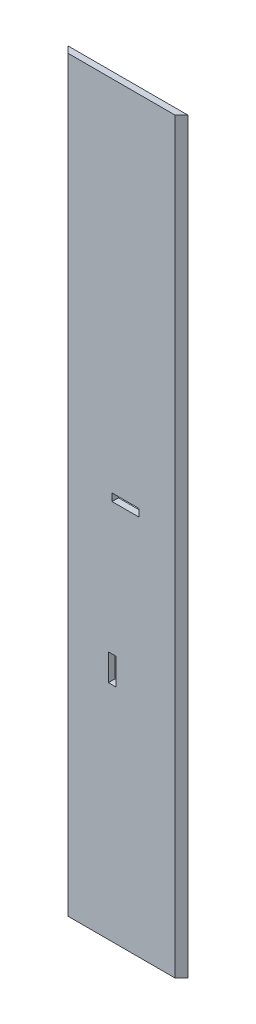
ISO-10303-21;
HEADER;
FILE_DESCRIPTION(('STEP AP214'),'2;1');
FILE_NAME('part.step','',(''),(''),'','','');
FILE_SCHEMA(('AUTOMOTIVE_DESIGN { 1 0 10303 214 1 1 1 1 }'));
ENDSEC;
DATA;
#1=APPLICATION_CONTEXT('core data for automotive mechanical design processes');
#2=APPLICATION_PROTOCOL_DEFINITION('international standard','automotive_design',2000,#1);
#3=PRODUCT_CONTEXT('',#1,'mechanical');
#4=PRODUCT('Part','Part','',(#3));
#5=PRODUCT_RELATED_PRODUCT_CATEGORY('part','',(#4));
#6=PRODUCT_DEFINITION_FORMATION('','',#4);
#7=PRODUCT_DEFINITION_CONTEXT('part definition',#1,'design');
#8=PRODUCT_DEFINITION('design','',#6,#7);
#9=PRODUCT_DEFINITION_SHAPE('','',#8);
#10=(LENGTH_UNIT() NAMED_UNIT(*) SI_UNIT(.MILLI.,.METRE.));
#11=(NAMED_UNIT(*) PLANE_ANGLE_UNIT() SI_UNIT($,.RADIAN.));
#12=(NAMED_UNIT(*) SI_UNIT($,.STERADIAN.) SOLID_ANGLE_UNIT());
#13=UNCERTAINTY_MEASURE_WITH_UNIT(LENGTH_MEASURE(1.E-05),#10,'distance_accuracy_value','');
#14=(GEOMETRIC_REPRESENTATION_CONTEXT(3) GLOBAL_UNCERTAINTY_ASSIGNED_CONTEXT((#13)) GLOBAL_UNIT_ASSIGNED_CONTEXT((#10,
#11,#12)) REPRESENTATION_CONTEXT('',''));
#15=CARTESIAN_POINT('',(0.,0.,0.));
#16=DIRECTION('',(0.,0.,1.));
#17=DIRECTION('',(1.,0.,0.));
#18=AXIS2_PLACEMENT_3D('',#15,#16,#17);
#19=CARTESIAN_POINT('',(25.,175.,3.00000000000006));
#20=DIRECTION('',(0.707106781186552,0.,0.707106781186543));
#21=DIRECTION('',(0.707106781186543,0.,-0.707106781186552));
#22=AXIS2_PLACEMENT_3D('',#19,#20,#21);
#23=PLANE('',#22);
#24=DIRECTION('',(-0.707106781186543,0.,0.707106781186552));
#25=VECTOR('',#24,1.);
#26=CARTESIAN_POINT('',(25.,-175.,3.00000000000006));
#27=LINE('',#26,#25);
#28=CARTESIAN_POINT('',(28.,-175.,0.));
#29=VERTEX_POINT('',#28);
#30=CARTESIAN_POINT('',(25.,-175.,3.));
#31=VERTEX_POINT('',#30);
#32=EDGE_CURVE('E234',#29,#31,#27,.T.);
#33=ORIENTED_EDGE('',*,*,#32,.F.);
#34=DIRECTION('',(0.,-1.,0.));
#35=VECTOR('',#34,1.);
#36=CARTESIAN_POINT('',(28.,175.,0.));
#37=LINE('',#36,#35);
#38=CARTESIAN_POINT('',(28.,175.,0.));
#39=VERTEX_POINT('',#38);
#40=EDGE_CURVE('E215',#39,#29,#37,.T.);
#41=ORIENTED_EDGE('',*,*,#40,.F.);
#42=DIRECTION('',(-0.707106781186543,0.,0.707106781186552));
#43=VECTOR('',#42,1.);
#44=CARTESIAN_POINT('',(25.,175.,3.00000000000006));
#45=LINE('',#44,#43);
#46=CARTESIAN_POINT('',(25.,175.,3.));
#47=VERTEX_POINT('',#46);
#48=EDGE_CURVE('E242',#39,#47,#45,.T.);
#49=ORIENTED_EDGE('',*,*,#48,.T.);
#50=DIRECTION('',(0.,1.,0.));
#51=VECTOR('',#50,1.);
#52=CARTESIAN_POINT('',(25.,-175.,3.));
#53=LINE('',#52,#51);
#54=EDGE_CURVE('E12',#31,#47,#53,.T.);
#55=ORIENTED_EDGE('',*,*,#54,.F.);
#56=EDGE_LOOP('',(#33,#41,#49,#55));
#57=FACE_BOUND('',#56,.T.);
#58=ADVANCED_FACE('F46',(#57),#23,.T.);
#59=CARTESIAN_POINT('',(25.,175.,3.));
#60=DIRECTION('',(0.,-1.,0.));
#61=DIRECTION('',(0.,0.,-1.));
#62=AXIS2_PLACEMENT_3D('',#59,#60,#61);
#63=PLANE('',#62);
#64=DIRECTION('',(-1.,0.,0.));
#65=VECTOR('',#64,1.);
#66=CARTESIAN_POINT('',(25.,175.,0.));
#67=LINE('',#66,#65);
#68=CARTESIAN_POINT('',(-28.,175.,0.));
#69=VERTEX_POINT('',#68);
#70=EDGE_CURVE('E238',#39,#69,#67,.T.);
#71=ORIENTED_EDGE('',*,*,#70,.T.);
#72=DIRECTION('',(-0.707106781186541,0.,-0.707106781186554));
#73=VECTOR('',#72,1.);
#74=CARTESIAN_POINT('',(-25.,175.,3.));
#75=LINE('',#74,#73);
#76=CARTESIAN_POINT('',(-25.,175.,3.));
#77=VERTEX_POINT('',#76);
#78=EDGE_CURVE('E225',#77,#69,#75,.T.);
#79=ORIENTED_EDGE('',*,*,#78,.F.);
#80=DIRECTION('',(-1.,0.,0.));
#81=VECTOR('',#80,1.);
#82=CARTESIAN_POINT('',(25.,175.,3.));
#83=LINE('',#82,#81);
#84=EDGE_CURVE('E249',#47,#77,#83,.T.);
#85=ORIENTED_EDGE('',*,*,#84,.F.);
#86=ORIENTED_EDGE('',*,*,#48,.F.);
#87=EDGE_LOOP('',(#71,#79,#85,#86));
#88=FACE_BOUND('',#87,.T.);
#89=ADVANCED_FACE('F48',(#88),#63,.F.);
#90=CARTESIAN_POINT('',(25.,-175.,3.));
#91=DIRECTION('',(0.,1.,0.));
#92=DIRECTION('',(0.,0.,1.));
#93=AXIS2_PLACEMENT_3D('',#90,#91,#92);
#94=PLANE('',#93);
#95=DIRECTION('',(1.,0.,0.));
#96=VECTOR('',#95,1.);
#97=CARTESIAN_POINT('',(25.,-175.,0.));
#98=LINE('',#97,#96);
#99=CARTESIAN_POINT('',(-28.,-175.,0.));
#100=VERTEX_POINT('',#99);
#101=EDGE_CURVE('E50',#100,#29,#98,.T.);
#102=ORIENTED_EDGE('',*,*,#101,.T.);
#103=ORIENTED_EDGE('',*,*,#32,.T.);
#104=DIRECTION('',(1.,0.,0.));
#105=VECTOR('',#104,1.);
#106=CARTESIAN_POINT('',(25.,-175.,3.));
#107=LINE('',#106,#105);
#108=CARTESIAN_POINT('',(-25.,-175.,3.));
#109=VERTEX_POINT('',#108);
#110=EDGE_CURVE('E56',#109,#31,#107,.T.);
#111=ORIENTED_EDGE('',*,*,#110,.F.);
#112=DIRECTION('',(-0.707106781186541,0.,-0.707106781186554));
#113=VECTOR('',#112,1.);
#114=CARTESIAN_POINT('',(-25.,-175.,3.));
#115=LINE('',#114,#113);
#116=EDGE_CURVE('E230',#109,#100,#115,.T.);
#117=ORIENTED_EDGE('',*,*,#116,.T.);
#118=EDGE_LOOP('',(#102,#103,#111,#117));
#119=FACE_BOUND('',#118,.T.);
#120=ADVANCED_FACE('F263',(#119),#94,.F.);
#121=CARTESIAN_POINT('',(0.,0.,3.));
#122=DIRECTION('',(0.,0.,-1.));
#123=DIRECTION('',(-1.,0.,0.));
#124=AXIS2_PLACEMENT_3D('',#121,#122,#123);
#125=PLANE('',#124);
#126=DIRECTION('',(0.,-1.,0.));
#127=VECTOR('',#126,1.);
#128=CARTESIAN_POINT('',(8.03805566879869,3.50000000000824,3.));
#129=LINE('',#128,#127);
#130=CARTESIAN_POINT('',(8.03805566879869,7.00000000000824,3.));
#131=VERTEX_POINT('',#130);
#132=CARTESIAN_POINT('',(8.03805566879869,3.50000000000824,3.));
#133=VERTEX_POINT('',#132);
#134=EDGE_CURVE('E174',#131,#133,#129,.T.);
#135=ORIENTED_EDGE('',*,*,#134,.T.);
#136=DIRECTION('',(-1.,0.,0.));
#137=VECTOR('',#136,1.);
#138=CARTESIAN_POINT('',(-4.46194433120131,3.50000000000824,3.));
#139=LINE('',#138,#137);
#140=CARTESIAN_POINT('',(-4.46194433120131,3.50000000000824,3.));
#141=VERTEX_POINT('',#140);
#142=EDGE_CURVE('E143',#133,#141,#139,.T.);
#143=ORIENTED_EDGE('',*,*,#142,.T.);
#144=DIRECTION('',(0.,1.,0.));
#145=VECTOR('',#144,1.);
#146=CARTESIAN_POINT('',(-4.46194433120131,3.50000000000824,3.));
#147=LINE('',#146,#145);
#148=CARTESIAN_POINT('',(-4.46194433120131,7.00000000000824,3.));
#149=VERTEX_POINT('',#148);
#150=EDGE_CURVE('E180',#141,#149,#147,.T.);
#151=ORIENTED_EDGE('',*,*,#150,.T.);
#152=DIRECTION('',(1.,0.,0.));
#153=VECTOR('',#152,1.);
#154=CARTESIAN_POINT('',(-4.46194433120131,7.00000000000824,3.));
#155=LINE('',#154,#153);
#156=EDGE_CURVE('E64',#149,#131,#155,.T.);
#157=ORIENTED_EDGE('',*,*,#156,.T.);
#158=EDGE_LOOP('',(#135,#143,#151,#157));
#159=FACE_BOUND('',#158,.T.);
#160=DIRECTION('',(-1.,0.,0.));
#161=VECTOR('',#160,1.);
#162=CARTESIAN_POINT('',(-6.19075959069311,-70.8073765712001,3.));
#163=LINE('',#162,#161);
#164=CARTESIAN_POINT('',(-2.69075959069311,-70.8073765712001,3.));
#165=VERTEX_POINT('',#164);
#166=CARTESIAN_POINT('',(-6.19075959069311,-70.8073765712001,3.));
#167=VERTEX_POINT('',#166);
#168=EDGE_CURVE('E197',#165,#167,#163,.T.);
#169=ORIENTED_EDGE('',*,*,#168,.T.);
#170=DIRECTION('',(0.,1.,0.));
#171=VECTOR('',#170,1.);
#172=CARTESIAN_POINT('',(-6.19075959069311,-70.8073765712001,3.));
#173=LINE('',#172,#171);
#174=CARTESIAN_POINT('',(-6.19075959069311,-58.3073765712001,3.));
#175=VERTEX_POINT('',#174);
#176=EDGE_CURVE('E186',#167,#175,#173,.T.);
#177=ORIENTED_EDGE('',*,*,#176,.T.);
#178=DIRECTION('',(1.,0.,0.));
#179=VECTOR('',#178,1.);
#180=CARTESIAN_POINT('',(-6.19075959069311,-58.3073765712001,3.));
#181=LINE('',#180,#179);
#182=CARTESIAN_POINT('',(-2.69075959069311,-58.3073765712001,3.));
#183=VERTEX_POINT('',#182);
#184=EDGE_CURVE('E190',#175,#183,#181,.T.);
#185=ORIENTED_EDGE('',*,*,#184,.T.);
#186=DIRECTION('',(0.,-1.,0.));
#187=VECTOR('',#186,1.);
#188=CARTESIAN_POINT('',(-2.69075959069311,-70.8073765712001,3.));
#189=LINE('',#188,#187);
#190=EDGE_CURVE('E72',#183,#165,#189,.T.);
#191=ORIENTED_EDGE('',*,*,#190,.T.);
#192=EDGE_LOOP('',(#169,#177,#185,#191));
#193=FACE_BOUND('',#192,.T.);
#194=ORIENTED_EDGE('',*,*,#84,.T.);
#195=DIRECTION('',(0.,-1.,0.));
#196=VECTOR('',#195,1.);
#197=CARTESIAN_POINT('',(-25.,-175.,3.));
#198=LINE('',#197,#196);
#199=EDGE_CURVE('E252',#77,#109,#198,.T.);
#200=ORIENTED_EDGE('',*,*,#199,.T.);
#201=ORIENTED_EDGE('',*,*,#110,.T.);
#202=ORIENTED_EDGE('',*,*,#54,.T.);
#203=EDGE_LOOP('',(#194,#200,#201,#202));
#204=FACE_BOUND('',#203,.T.);
#205=ADVANCED_FACE('F273',(#159,#193,#204),#125,.F.);
#206=CARTESIAN_POINT('',(0.,0.,0.));
#207=DIRECTION('',(0.,0.,-1.));
#208=DIRECTION('',(-1.,0.,0.));
#209=AXIS2_PLACEMENT_3D('',#206,#207,#208);
#210=PLANE('',#209);
#211=DIRECTION('',(-1.,0.,0.));
#212=VECTOR('',#211,1.);
#213=CARTESIAN_POINT('',(-4.46194433120131,3.50000000000824,0.));
#214=LINE('',#213,#212);
#215=CARTESIAN_POINT('',(8.03805566879869,3.50000000000824,0.));
#216=VERTEX_POINT('',#215);
#217=CARTESIAN_POINT('',(-4.46194433120131,3.50000000000824,0.));
#218=VERTEX_POINT('',#217);
#219=EDGE_CURVE('E140',#216,#218,#214,.T.);
#220=ORIENTED_EDGE('',*,*,#219,.F.);
#221=DIRECTION('',(0.,-1.,0.));
#222=VECTOR('',#221,1.);
#223=CARTESIAN_POINT('',(8.03805566879869,3.50000000000824,0.));
#224=LINE('',#223,#222);
#225=CARTESIAN_POINT('',(8.03805566879869,7.00000000000824,0.));
#226=VERTEX_POINT('',#225);
#227=EDGE_CURVE('E151',#226,#216,#224,.T.);
#228=ORIENTED_EDGE('',*,*,#227,.F.);
#229=DIRECTION('',(1.,0.,0.));
#230=VECTOR('',#229,1.);
#231=CARTESIAN_POINT('',(-4.46194433120131,7.00000000000824,0.));
#232=LINE('',#231,#230);
#233=CARTESIAN_POINT('',(-4.46194433120131,7.00000000000824,0.));
#234=VERTEX_POINT('',#233);
#235=EDGE_CURVE('E157',#234,#226,#232,.T.);
#236=ORIENTED_EDGE('',*,*,#235,.F.);
#237=DIRECTION('',(0.,1.,0.));
#238=VECTOR('',#237,1.);
#239=CARTESIAN_POINT('',(-4.46194433120131,3.50000000000824,0.));
#240=LINE('',#239,#238);
#241=EDGE_CURVE('E163',#218,#234,#240,.T.);
#242=ORIENTED_EDGE('',*,*,#241,.F.);
#243=EDGE_LOOP('',(#220,#228,#236,#242));
#244=FACE_BOUND('',#243,.T.);
#245=DIRECTION('',(0.,1.,0.));
#246=VECTOR('',#245,1.);
#247=CARTESIAN_POINT('',(-6.19075959069311,-70.8073765712001,0.));
#248=LINE('',#247,#246);
#249=CARTESIAN_POINT('',(-6.19075959069311,-70.8073765712001,0.));
#250=VERTEX_POINT('',#249);
#251=CARTESIAN_POINT('',(-6.19075959069311,-58.3073765712001,0.));
#252=VERTEX_POINT('',#251);
#253=EDGE_CURVE('E165',#250,#252,#248,.T.);
#254=ORIENTED_EDGE('',*,*,#253,.F.);
#255=DIRECTION('',(-1.,0.,0.));
#256=VECTOR('',#255,1.);
#257=CARTESIAN_POINT('',(-6.19075959069311,-70.8073765712001,0.));
#258=LINE('',#257,#256);
#259=CARTESIAN_POINT('',(-2.69075959069311,-70.8073765712001,0.));
#260=VERTEX_POINT('',#259);
#261=EDGE_CURVE('E191',#260,#250,#258,.T.);
#262=ORIENTED_EDGE('',*,*,#261,.F.);
#263=DIRECTION('',(0.,-1.,0.));
#264=VECTOR('',#263,1.);
#265=CARTESIAN_POINT('',(-2.69075959069311,-70.8073765712001,0.));
#266=LINE('',#265,#264);
#267=CARTESIAN_POINT('',(-2.69075959069311,-58.3073765712001,0.));
#268=VERTEX_POINT('',#267);
#269=EDGE_CURVE('E205',#268,#260,#266,.T.);
#270=ORIENTED_EDGE('',*,*,#269,.F.);
#271=DIRECTION('',(1.,0.,0.));
#272=VECTOR('',#271,1.);
#273=CARTESIAN_POINT('',(-6.19075959069311,-58.3073765712001,0.));
#274=LINE('',#273,#272);
#275=EDGE_CURVE('E169',#252,#268,#274,.T.);
#276=ORIENTED_EDGE('',*,*,#275,.F.);
#277=EDGE_LOOP('',(#254,#262,#270,#276));
#278=FACE_BOUND('',#277,.T.);
#279=ORIENTED_EDGE('',*,*,#70,.F.);
#280=ORIENTED_EDGE('',*,*,#40,.T.);
#281=ORIENTED_EDGE('',*,*,#101,.F.);
#282=DIRECTION('',(0.,-1.,0.));
#283=VECTOR('',#282,1.);
#284=CARTESIAN_POINT('',(-28.,175.,0.));
#285=LINE('',#284,#283);
#286=EDGE_CURVE('E229',#69,#100,#285,.T.);
#287=ORIENTED_EDGE('',*,*,#286,.F.);
#288=EDGE_LOOP('',(#279,#280,#281,#287));
#289=FACE_BOUND('',#288,.T.);
#290=ADVANCED_FACE('F160',(#244,#278,#289),#210,.T.);
#291=CARTESIAN_POINT('',(-25.,175.,3.));
#292=DIRECTION('',(-0.707106781186554,0.,0.707106781186541));
#293=DIRECTION('',(0.707106781186541,0.,0.707106781186554));
#294=AXIS2_PLACEMENT_3D('',#291,#292,#293);
#295=PLANE('',#294);
#296=ORIENTED_EDGE('',*,*,#116,.F.);
#297=ORIENTED_EDGE('',*,*,#199,.F.);
#298=ORIENTED_EDGE('',*,*,#78,.T.);
#299=ORIENTED_EDGE('',*,*,#286,.T.);
#300=EDGE_LOOP('',(#296,#297,#298,#299));
#301=FACE_BOUND('',#300,.T.);
#302=ADVANCED_FACE('F276',(#301),#295,.T.);
#303=CARTESIAN_POINT('',(-6.19075959069311,-70.8073765712001,3.));
#304=DIRECTION('',(-1.,0.,0.));
#305=DIRECTION('',(0.,0.,1.));
#306=AXIS2_PLACEMENT_3D('',#303,#304,#305);
#307=PLANE('',#306);
#308=ORIENTED_EDGE('',*,*,#253,.T.);
#309=DIRECTION('',(0.,0.,-1.));
#310=VECTOR('',#309,1.);
#311=CARTESIAN_POINT('',(-6.19075959069311,-58.3073765712001,3.));
#312=LINE('',#311,#310);
#313=EDGE_CURVE('E200',#175,#252,#312,.T.);
#314=ORIENTED_EDGE('',*,*,#313,.F.);
#315=ORIENTED_EDGE('',*,*,#176,.F.);
#316=DIRECTION('',(0.,0.,-1.));
#317=VECTOR('',#316,1.);
#318=CARTESIAN_POINT('',(-6.19075959069311,-70.8073765712001,3.));
#319=LINE('',#318,#317);
#320=EDGE_CURVE('E212',#167,#250,#319,.T.);
#321=ORIENTED_EDGE('',*,*,#320,.T.);
#322=EDGE_LOOP('',(#308,#314,#315,#321));
#323=FACE_BOUND('',#322,.T.);
#324=ADVANCED_FACE('F278',(#323),#307,.F.);
#325=CARTESIAN_POINT('',(-6.19075959069311,-70.8073765712001,3.));
#326=DIRECTION('',(0.,-1.,0.));
#327=DIRECTION('',(0.,0.,-1.));
#328=AXIS2_PLACEMENT_3D('',#325,#326,#327);
#329=PLANE('',#328);
#330=ORIENTED_EDGE('',*,*,#261,.T.);
#331=ORIENTED_EDGE('',*,*,#320,.F.);
#332=ORIENTED_EDGE('',*,*,#168,.F.);
#333=DIRECTION('',(0.,0.,-1.));
#334=VECTOR('',#333,1.);
#335=CARTESIAN_POINT('',(-2.69075959069311,-70.8073765712001,3.));
#336=LINE('',#335,#334);
#337=EDGE_CURVE('E216',#165,#260,#336,.T.);
#338=ORIENTED_EDGE('',*,*,#337,.T.);
#339=EDGE_LOOP('',(#330,#331,#332,#338));
#340=FACE_BOUND('',#339,.T.);
#341=ADVANCED_FACE('F285',(#340),#329,.F.);
#342=CARTESIAN_POINT('',(-2.69075959069311,-70.8073765712001,3.));
#343=DIRECTION('',(1.,0.,0.));
#344=DIRECTION('',(0.,1.,0.));
#345=AXIS2_PLACEMENT_3D('',#342,#343,#344);
#346=PLANE('',#345);
#347=ORIENTED_EDGE('',*,*,#269,.T.);
#348=ORIENTED_EDGE('',*,*,#337,.F.);
#349=ORIENTED_EDGE('',*,*,#190,.F.);
#350=DIRECTION('',(0.,0.,-1.));
#351=VECTOR('',#350,1.);
#352=CARTESIAN_POINT('',(-2.69075959069311,-58.3073765712001,3.));
#353=LINE('',#352,#351);
#354=EDGE_CURVE('E219',#183,#268,#353,.T.);
#355=ORIENTED_EDGE('',*,*,#354,.T.);
#356=EDGE_LOOP('',(#347,#348,#349,#355));
#357=FACE_BOUND('',#356,.T.);
#358=ADVANCED_FACE('F353',(#357),#346,.F.);
#359=CARTESIAN_POINT('',(-6.19075959069311,-58.3073765712001,3.));
#360=DIRECTION('',(0.,1.,0.));
#361=DIRECTION('',(0.,0.,1.));
#362=AXIS2_PLACEMENT_3D('',#359,#360,#361);
#363=PLANE('',#362);
#364=ORIENTED_EDGE('',*,*,#275,.T.);
#365=ORIENTED_EDGE('',*,*,#354,.F.);
#366=ORIENTED_EDGE('',*,*,#184,.F.);
#367=ORIENTED_EDGE('',*,*,#313,.T.);
#368=EDGE_LOOP('',(#364,#365,#366,#367));
#369=FACE_BOUND('',#368,.T.);
#370=ADVANCED_FACE('F362',(#369),#363,.F.);
#371=CARTESIAN_POINT('',(-4.46194433120131,3.50000000000824,3.));
#372=DIRECTION('',(0.,-1.,0.));
#373=DIRECTION('',(0.,0.,-1.));
#374=AXIS2_PLACEMENT_3D('',#371,#372,#373);
#375=PLANE('',#374);
#376=ORIENTED_EDGE('',*,*,#219,.T.);
#377=DIRECTION('',(0.,0.,-1.));
#378=VECTOR('',#377,1.);
#379=CARTESIAN_POINT('',(-4.46194433120131,3.50000000000824,3.));
#380=LINE('',#379,#378);
#381=EDGE_CURVE('E177',#141,#218,#380,.T.);
#382=ORIENTED_EDGE('',*,*,#381,.F.);
#383=ORIENTED_EDGE('',*,*,#142,.F.);
#384=DIRECTION('',(0.,0.,-1.));
#385=VECTOR('',#384,1.);
#386=CARTESIAN_POINT('',(8.03805566879869,3.50000000000824,3.));
#387=LINE('',#386,#385);
#388=EDGE_CURVE('E136',#133,#216,#387,.T.);
#389=ORIENTED_EDGE('',*,*,#388,.T.);
#390=EDGE_LOOP('',(#376,#382,#383,#389));
#391=FACE_BOUND('',#390,.T.);
#392=ADVANCED_FACE('F138',(#391),#375,.F.);
#393=CARTESIAN_POINT('',(8.03805566879869,3.50000000000824,3.));
#394=DIRECTION('',(1.,0.,0.));
#395=DIRECTION('',(0.,1.,0.));
#396=AXIS2_PLACEMENT_3D('',#393,#394,#395);
#397=PLANE('',#396);
#398=ORIENTED_EDGE('',*,*,#227,.T.);
#399=ORIENTED_EDGE('',*,*,#388,.F.);
#400=ORIENTED_EDGE('',*,*,#134,.F.);
#401=DIRECTION('',(0.,0.,-1.));
#402=VECTOR('',#401,1.);
#403=CARTESIAN_POINT('',(8.03805566879869,7.00000000000824,3.));
#404=LINE('',#403,#402);
#405=EDGE_CURVE('E148',#131,#226,#404,.T.);
#406=ORIENTED_EDGE('',*,*,#405,.T.);
#407=EDGE_LOOP('',(#398,#399,#400,#406));
#408=FACE_BOUND('',#407,.T.);
#409=ADVANCED_FACE('F152',(#408),#397,.F.);
#410=CARTESIAN_POINT('',(-4.46194433120131,7.00000000000824,3.));
#411=DIRECTION('',(0.,1.,0.));
#412=DIRECTION('',(0.,0.,1.));
#413=AXIS2_PLACEMENT_3D('',#410,#411,#412);
#414=PLANE('',#413);
#415=ORIENTED_EDGE('',*,*,#235,.T.);
#416=ORIENTED_EDGE('',*,*,#405,.F.);
#417=ORIENTED_EDGE('',*,*,#156,.F.);
#418=DIRECTION('',(0.,0.,-1.));
#419=VECTOR('',#418,1.);
#420=CARTESIAN_POINT('',(-4.46194433120131,7.00000000000824,3.));
#421=LINE('',#420,#419);
#422=EDGE_CURVE('E416',#149,#234,#421,.T.);
#423=ORIENTED_EDGE('',*,*,#422,.T.);
#424=EDGE_LOOP('',(#415,#416,#417,#423));
#425=FACE_BOUND('',#424,.T.);
#426=ADVANCED_FACE('F385',(#425),#414,.F.);
#427=CARTESIAN_POINT('',(-4.46194433120131,3.50000000000824,3.));
#428=DIRECTION('',(-1.,0.,0.));
#429=DIRECTION('',(0.,0.,1.));
#430=AXIS2_PLACEMENT_3D('',#427,#428,#429);
#431=PLANE('',#430);
#432=ORIENTED_EDGE('',*,*,#241,.T.);
#433=ORIENTED_EDGE('',*,*,#422,.F.);
#434=ORIENTED_EDGE('',*,*,#150,.F.);
#435=ORIENTED_EDGE('',*,*,#381,.T.);
#436=EDGE_LOOP('',(#432,#433,#434,#435));
#437=FACE_BOUND('',#436,.T.);
#438=ADVANCED_FACE('F393',(#437),#431,.F.);
#439=CLOSED_SHELL('',(#58,#89,#120,#205,#290,#302,#324,#341,#358,#370,#392,#409,#426,#438));
#440=MANIFOLD_SOLID_BREP('B2',#439);
#441=ADVANCED_BREP_SHAPE_REPRESENTATION('',(#18,#440),#14);
#442=SHAPE_DEFINITION_REPRESENTATION(#9,#441);
ENDSEC;
END-ISO-10303-21;
